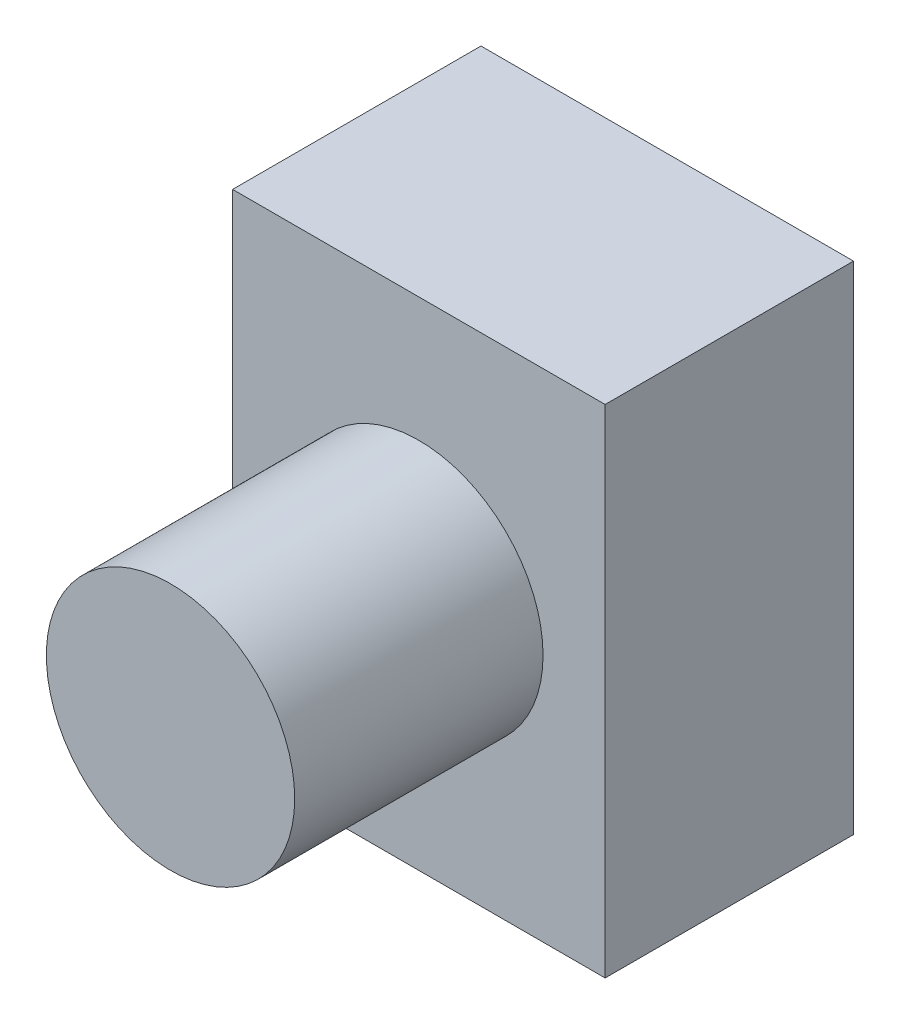
ISO-10303-21;
HEADER;
FILE_DESCRIPTION(('STEP AP214'),'2;1');
FILE_NAME('part.step','',(''),(''),'','','');
FILE_SCHEMA(('AUTOMOTIVE_DESIGN { 1 0 10303 214 1 1 1 1 }'));
ENDSEC;
DATA;
#1=APPLICATION_CONTEXT('core data for automotive mechanical design processes');
#2=APPLICATION_PROTOCOL_DEFINITION('international standard','automotive_design',2000,#1);
#3=PRODUCT_CONTEXT('',#1,'mechanical');
#4=PRODUCT('Part','Part','',(#3));
#5=PRODUCT_RELATED_PRODUCT_CATEGORY('part','',(#4));
#6=PRODUCT_DEFINITION_FORMATION('','',#4);
#7=PRODUCT_DEFINITION_CONTEXT('part definition',#1,'design');
#8=PRODUCT_DEFINITION('design','',#6,#7);
#9=PRODUCT_DEFINITION_SHAPE('','',#8);
#10=(LENGTH_UNIT() NAMED_UNIT(*) SI_UNIT(.MILLI.,.METRE.));
#11=(NAMED_UNIT(*) PLANE_ANGLE_UNIT() SI_UNIT($,.RADIAN.));
#12=(NAMED_UNIT(*) SI_UNIT($,.STERADIAN.) SOLID_ANGLE_UNIT());
#13=UNCERTAINTY_MEASURE_WITH_UNIT(LENGTH_MEASURE(1.E-05),#10,'distance_accuracy_value','');
#14=(GEOMETRIC_REPRESENTATION_CONTEXT(3) GLOBAL_UNCERTAINTY_ASSIGNED_CONTEXT((#13)) GLOBAL_UNIT_ASSIGNED_CONTEXT((#10,
#11,#12)) REPRESENTATION_CONTEXT('',''));
#15=CARTESIAN_POINT('',(0.,0.,0.));
#16=DIRECTION('',(0.,0.,1.));
#17=DIRECTION('',(1.,0.,0.));
#18=AXIS2_PLACEMENT_3D('',#15,#16,#17);
#19=CARTESIAN_POINT('',(15.,20.,20.));
#20=DIRECTION('',(-1.,0.,0.));
#21=DIRECTION('',(0.,-1.,0.));
#22=AXIS2_PLACEMENT_3D('',#19,#20,#21);
#23=PLANE('',#22);
#24=DIRECTION('',(0.,1.,0.));
#25=VECTOR('',#24,1.);
#26=CARTESIAN_POINT('',(15.,20.,0.));
#27=LINE('',#26,#25);
#28=CARTESIAN_POINT('',(15.,-20.,0.));
#29=VERTEX_POINT('',#28);
#30=CARTESIAN_POINT('',(15.,20.,0.));
#31=VERTEX_POINT('',#30);
#32=EDGE_CURVE('E110',#29,#31,#27,.T.);
#33=ORIENTED_EDGE('',*,*,#32,.T.);
#34=DIRECTION('',(0.,0.,-1.));
#35=VECTOR('',#34,1.);
#36=CARTESIAN_POINT('',(15.,20.,20.));
#37=LINE('',#36,#35);
#38=CARTESIAN_POINT('',(15.,20.,20.));
#39=VERTEX_POINT('',#38);
#40=EDGE_CURVE('E42',#39,#31,#37,.T.);
#41=ORIENTED_EDGE('',*,*,#40,.F.);
#42=DIRECTION('',(0.,1.,0.));
#43=VECTOR('',#42,1.);
#44=CARTESIAN_POINT('',(15.,20.,20.));
#45=LINE('',#44,#43);
#46=CARTESIAN_POINT('',(15.,-20.,20.));
#47=VERTEX_POINT('',#46);
#48=EDGE_CURVE('E93',#47,#39,#45,.T.);
#49=ORIENTED_EDGE('',*,*,#48,.F.);
#50=DIRECTION('',(0.,0.,-1.));
#51=VECTOR('',#50,1.);
#52=CARTESIAN_POINT('',(15.,-20.,20.));
#53=LINE('',#52,#51);
#54=EDGE_CURVE('E106',#47,#29,#53,.T.);
#55=ORIENTED_EDGE('',*,*,#54,.T.);
#56=EDGE_LOOP('',(#33,#41,#49,#55));
#57=FACE_BOUND('',#56,.T.);
#58=ADVANCED_FACE('F39',(#57),#23,.F.);
#59=CARTESIAN_POINT('',(-15.,20.,20.));
#60=DIRECTION('',(0.,-1.,0.));
#61=DIRECTION('',(0.,0.,-1.));
#62=AXIS2_PLACEMENT_3D('',#59,#60,#61);
#63=PLANE('',#62);
#64=DIRECTION('',(-1.,0.,0.));
#65=VECTOR('',#64,1.);
#66=CARTESIAN_POINT('',(-15.,20.,0.));
#67=LINE('',#66,#65);
#68=CARTESIAN_POINT('',(-15.,20.,0.));
#69=VERTEX_POINT('',#68);
#70=EDGE_CURVE('E99',#31,#69,#67,.T.);
#71=ORIENTED_EDGE('',*,*,#70,.T.);
#72=DIRECTION('',(0.,0.,-1.));
#73=VECTOR('',#72,1.);
#74=CARTESIAN_POINT('',(-15.,20.,20.));
#75=LINE('',#74,#73);
#76=CARTESIAN_POINT('',(-15.,20.,20.));
#77=VERTEX_POINT('',#76);
#78=EDGE_CURVE('E97',#77,#69,#75,.T.);
#79=ORIENTED_EDGE('',*,*,#78,.F.);
#80=DIRECTION('',(-1.,0.,0.));
#81=VECTOR('',#80,1.);
#82=CARTESIAN_POINT('',(-15.,20.,20.));
#83=LINE('',#82,#81);
#84=EDGE_CURVE('E88',#39,#77,#83,.T.);
#85=ORIENTED_EDGE('',*,*,#84,.F.);
#86=ORIENTED_EDGE('',*,*,#40,.T.);
#87=EDGE_LOOP('',(#71,#79,#85,#86));
#88=FACE_BOUND('',#87,.T.);
#89=ADVANCED_FACE('F98',(#88),#63,.F.);
#90=CARTESIAN_POINT('',(-15.,20.,20.));
#91=DIRECTION('',(1.,0.,0.));
#92=DIRECTION('',(0.,1.,0.));
#93=AXIS2_PLACEMENT_3D('',#90,#91,#92);
#94=PLANE('',#93);
#95=DIRECTION('',(0.,-1.,0.));
#96=VECTOR('',#95,1.);
#97=CARTESIAN_POINT('',(-15.,20.,0.));
#98=LINE('',#97,#96);
#99=CARTESIAN_POINT('',(-15.,-20.,0.));
#100=VERTEX_POINT('',#99);
#101=EDGE_CURVE('E74',#69,#100,#98,.T.);
#102=ORIENTED_EDGE('',*,*,#101,.T.);
#103=DIRECTION('',(0.,0.,-1.));
#104=VECTOR('',#103,1.);
#105=CARTESIAN_POINT('',(-15.,-20.,20.));
#106=LINE('',#105,#104);
#107=CARTESIAN_POINT('',(-15.,-20.,20.));
#108=VERTEX_POINT('',#107);
#109=EDGE_CURVE('E101',#108,#100,#106,.T.);
#110=ORIENTED_EDGE('',*,*,#109,.F.);
#111=DIRECTION('',(0.,-1.,0.));
#112=VECTOR('',#111,1.);
#113=CARTESIAN_POINT('',(-15.,20.,20.));
#114=LINE('',#113,#112);
#115=EDGE_CURVE('E91',#77,#108,#114,.T.);
#116=ORIENTED_EDGE('',*,*,#115,.F.);
#117=ORIENTED_EDGE('',*,*,#78,.T.);
#118=EDGE_LOOP('',(#102,#110,#116,#117));
#119=FACE_BOUND('',#118,.T.);
#120=ADVANCED_FACE('F102',(#119),#94,.F.);
#121=CARTESIAN_POINT('',(-15.,-20.,20.));
#122=DIRECTION('',(0.,1.,0.));
#123=DIRECTION('',(0.,0.,1.));
#124=AXIS2_PLACEMENT_3D('',#121,#122,#123);
#125=PLANE('',#124);
#126=DIRECTION('',(1.,0.,0.));
#127=VECTOR('',#126,1.);
#128=CARTESIAN_POINT('',(-15.,-20.,0.));
#129=LINE('',#128,#127);
#130=EDGE_CURVE('E80',#100,#29,#129,.T.);
#131=ORIENTED_EDGE('',*,*,#130,.T.);
#132=ORIENTED_EDGE('',*,*,#54,.F.);
#133=DIRECTION('',(1.,0.,0.));
#134=VECTOR('',#133,1.);
#135=CARTESIAN_POINT('',(-15.,-20.,20.));
#136=LINE('',#135,#134);
#137=EDGE_CURVE('E57',#108,#47,#136,.T.);
#138=ORIENTED_EDGE('',*,*,#137,.F.);
#139=ORIENTED_EDGE('',*,*,#109,.T.);
#140=EDGE_LOOP('',(#131,#132,#138,#139));
#141=FACE_BOUND('',#140,.T.);
#142=ADVANCED_FACE('F124',(#141),#125,.F.);
#143=CARTESIAN_POINT('',(0.,0.,20.));
#144=DIRECTION('',(0.,0.,1.));
#145=DIRECTION('',(1.,0.,0.));
#146=AXIS2_PLACEMENT_3D('',#143,#144,#145);
#147=PLANE('',#146);
#148=CARTESIAN_POINT('',(0.,0.,20.));
#149=DIRECTION('',(0.,0.,1.));
#150=DIRECTION('',(1.,0.,0.));
#151=AXIS2_PLACEMENT_3D('',#148,#149,#150);
#152=CIRCLE('',#151,10.);
#153=CARTESIAN_POINT('',(10.,0.,20.));
#154=VERTEX_POINT('',#153);
#155=EDGE_CURVE('E11',#154,#154,#152,.T.);
#156=ORIENTED_EDGE('',*,*,#155,.F.);
#157=EDGE_LOOP('',(#156));
#158=FACE_BOUND('',#157,.T.);
#159=ORIENTED_EDGE('',*,*,#48,.T.);
#160=ORIENTED_EDGE('',*,*,#84,.T.);
#161=ORIENTED_EDGE('',*,*,#115,.T.);
#162=ORIENTED_EDGE('',*,*,#137,.T.);
#163=EDGE_LOOP('',(#159,#160,#161,#162));
#164=FACE_BOUND('',#163,.T.);
#165=ADVANCED_FACE('F89',(#158,#164),#147,.T.);
#166=CARTESIAN_POINT('',(0.,0.,0.));
#167=DIRECTION('',(0.,0.,1.));
#168=DIRECTION('',(1.,0.,0.));
#169=AXIS2_PLACEMENT_3D('',#166,#167,#168);
#170=PLANE('',#169);
#171=ORIENTED_EDGE('',*,*,#32,.F.);
#172=ORIENTED_EDGE('',*,*,#130,.F.);
#173=ORIENTED_EDGE('',*,*,#101,.F.);
#174=ORIENTED_EDGE('',*,*,#70,.F.);
#175=EDGE_LOOP('',(#171,#172,#173,#174));
#176=FACE_BOUND('',#175,.T.);
#177=ADVANCED_FACE('F127',(#176),#170,.F.);
#178=CARTESIAN_POINT('',(0.,0.,40.));
#179=DIRECTION('',(0.,0.,-1.));
#180=DIRECTION('',(-1.,0.,0.));
#181=AXIS2_PLACEMENT_3D('',#178,#179,#180);
#182=CYLINDRICAL_SURFACE('',#181,10.);
#183=CARTESIAN_POINT('',(0.,0.,40.));
#184=DIRECTION('',(0.,0.,1.));
#185=DIRECTION('',(1.,0.,0.));
#186=AXIS2_PLACEMENT_3D('',#183,#184,#185);
#187=CIRCLE('',#186,10.);
#188=CARTESIAN_POINT('',(10.,0.,40.));
#189=VERTEX_POINT('',#188);
#190=EDGE_CURVE('E114',#189,#189,#187,.T.);
#191=ORIENTED_EDGE('',*,*,#190,.F.);
#192=EDGE_LOOP('',(#191));
#193=FACE_BOUND('',#192,.T.);
#194=ORIENTED_EDGE('',*,*,#155,.T.);
#195=EDGE_LOOP('',(#194));
#196=FACE_BOUND('',#195,.T.);
#197=ADVANCED_FACE('F137',(#193,#196),#182,.T.);
#198=CARTESIAN_POINT('',(0.,0.,40.));
#199=DIRECTION('',(0.,0.,1.));
#200=DIRECTION('',(1.,0.,0.));
#201=AXIS2_PLACEMENT_3D('',#198,#199,#200);
#202=PLANE('',#201);
#203=ORIENTED_EDGE('',*,*,#190,.T.);
#204=EDGE_LOOP('',(#203));
#205=FACE_BOUND('',#204,.T.);
#206=ADVANCED_FACE('F135',(#205),#202,.T.);
#207=CLOSED_SHELL('',(#58,#89,#120,#142,#165,#177,#197,#206));
#208=MANIFOLD_SOLID_BREP('B2',#207);
#209=ADVANCED_BREP_SHAPE_REPRESENTATION('',(#18,#208),#14);
#210=SHAPE_DEFINITION_REPRESENTATION(#9,#209);
ENDSEC;
END-ISO-10303-21;
